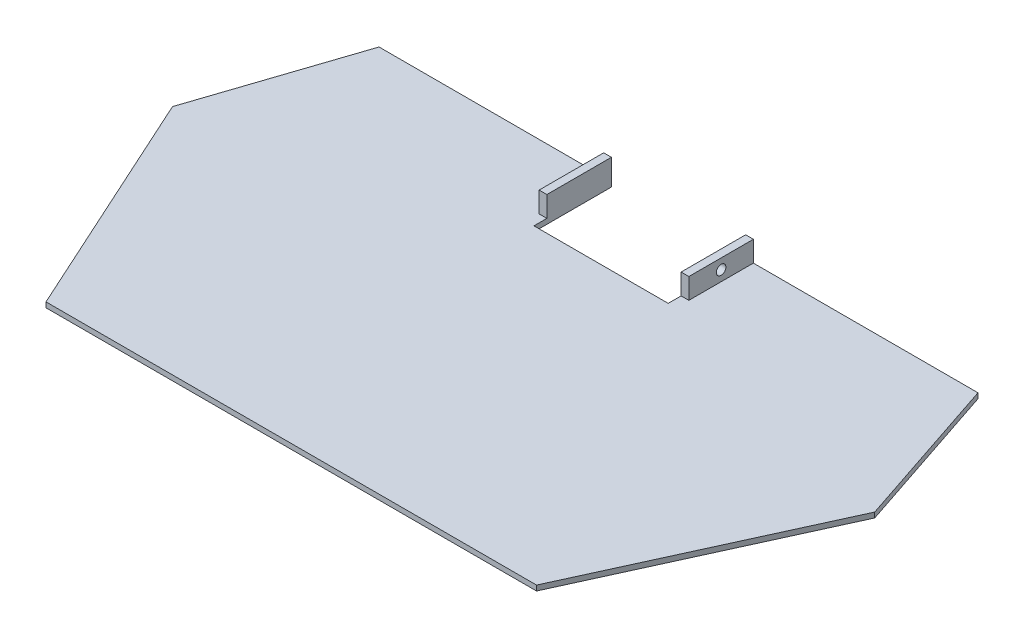
ISO-10303-21;
HEADER;
FILE_DESCRIPTION(('STEP AP214'),'2;1');
FILE_NAME('part.step','',(''),(''),'','','');
FILE_SCHEMA(('AUTOMOTIVE_DESIGN { 1 0 10303 214 1 1 1 1 }'));
ENDSEC;
DATA;
#1=APPLICATION_CONTEXT('core data for automotive mechanical design processes');
#2=APPLICATION_PROTOCOL_DEFINITION('international standard','automotive_design',2000,#1);
#3=PRODUCT_CONTEXT('',#1,'mechanical');
#4=PRODUCT('Part','Part','',(#3));
#5=PRODUCT_RELATED_PRODUCT_CATEGORY('part','',(#4));
#6=PRODUCT_DEFINITION_FORMATION('','',#4);
#7=PRODUCT_DEFINITION_CONTEXT('part definition',#1,'design');
#8=PRODUCT_DEFINITION('design','',#6,#7);
#9=PRODUCT_DEFINITION_SHAPE('','',#8);
#10=(LENGTH_UNIT() NAMED_UNIT(*) SI_UNIT(.MILLI.,.METRE.));
#11=(NAMED_UNIT(*) PLANE_ANGLE_UNIT() SI_UNIT($,.RADIAN.));
#12=(NAMED_UNIT(*) SI_UNIT($,.STERADIAN.) SOLID_ANGLE_UNIT());
#13=UNCERTAINTY_MEASURE_WITH_UNIT(LENGTH_MEASURE(1.E-05),#10,'distance_accuracy_value','');
#14=(GEOMETRIC_REPRESENTATION_CONTEXT(3) GLOBAL_UNCERTAINTY_ASSIGNED_CONTEXT((#13)) GLOBAL_UNIT_ASSIGNED_CONTEXT((#10,
#11,#12)) REPRESENTATION_CONTEXT('',''));
#15=CARTESIAN_POINT('',(0.,0.,0.));
#16=DIRECTION('',(0.,0.,1.));
#17=DIRECTION('',(1.,0.,0.));
#18=AXIS2_PLACEMENT_3D('',#15,#16,#17);
#19=CARTESIAN_POINT('',(0.,2.,0.));
#20=DIRECTION('',(0.,1.,0.));
#21=DIRECTION('',(0.,0.,1.));
#22=AXIS2_PLACEMENT_3D('',#19,#20,#21);
#23=PLANE('',#22);
#24=DIRECTION('',(0.,0.,-1.));
#25=VECTOR('',#24,1.);
#26=CARTESIAN_POINT('',(29.,2.,-60.));
#27=LINE('',#26,#25);
#28=CARTESIAN_POINT('',(29.,2.,-35.));
#29=VERTEX_POINT('',#28);
#30=CARTESIAN_POINT('',(29.,2.,-60.));
#31=VERTEX_POINT('',#30);
#32=EDGE_CURVE('E153',#29,#31,#27,.T.);
#33=ORIENTED_EDGE('',*,*,#32,.F.);
#34=DIRECTION('',(1.,0.,0.));
#35=VECTOR('',#34,1.);
#36=CARTESIAN_POINT('',(26.,2.,-35.));
#37=LINE('',#36,#35);
#38=CARTESIAN_POINT('',(26.,2.,-35.));
#39=VERTEX_POINT('',#38);
#40=EDGE_CURVE('E160',#39,#29,#37,.T.);
#41=ORIENTED_EDGE('',*,*,#40,.F.);
#42=DIRECTION('',(0.,0.,1.));
#43=VECTOR('',#42,1.);
#44=CARTESIAN_POINT('',(26.,2.,-30.));
#45=LINE('',#44,#43);
#46=CARTESIAN_POINT('',(26.,2.,-30.));
#47=VERTEX_POINT('',#46);
#48=EDGE_CURVE('E173',#39,#47,#45,.T.);
#49=ORIENTED_EDGE('',*,*,#48,.T.);
#50=DIRECTION('',(-1.,0.,0.));
#51=VECTOR('',#50,1.);
#52=CARTESIAN_POINT('',(26.,2.,-30.));
#53=LINE('',#52,#51);
#54=CARTESIAN_POINT('',(-26.,2.,-30.));
#55=VERTEX_POINT('',#54);
#56=EDGE_CURVE('E175',#47,#55,#53,.T.);
#57=ORIENTED_EDGE('',*,*,#56,.T.);
#58=DIRECTION('',(0.,0.,-1.));
#59=VECTOR('',#58,1.);
#60=CARTESIAN_POINT('',(-26.,2.,-30.));
#61=LINE('',#60,#59);
#62=CARTESIAN_POINT('',(-26.,2.,-35.));
#63=VERTEX_POINT('',#62);
#64=EDGE_CURVE('E182',#55,#63,#61,.T.);
#65=ORIENTED_EDGE('',*,*,#64,.T.);
#66=DIRECTION('',(1.,0.,0.));
#67=VECTOR('',#66,1.);
#68=CARTESIAN_POINT('',(-26.,2.,-35.));
#69=LINE('',#68,#67);
#70=CARTESIAN_POINT('',(-29.,2.,-35.));
#71=VERTEX_POINT('',#70);
#72=EDGE_CURVE('E265',#71,#63,#69,.T.);
#73=ORIENTED_EDGE('',*,*,#72,.F.);
#74=DIRECTION('',(0.,0.,1.));
#75=VECTOR('',#74,1.);
#76=CARTESIAN_POINT('',(-29.,2.,-60.));
#77=LINE('',#76,#75);
#78=CARTESIAN_POINT('',(-29.,2.,-60.));
#79=VERTEX_POINT('',#78);
#80=EDGE_CURVE('E63',#79,#71,#77,.T.);
#81=ORIENTED_EDGE('',*,*,#80,.F.);
#82=DIRECTION('',(-1.,0.,0.));
#83=VECTOR('',#82,1.);
#84=CARTESIAN_POINT('',(-26.,2.,-60.));
#85=LINE('',#84,#83);
#86=CARTESIAN_POINT('',(-116.,2.,-60.));
#87=VERTEX_POINT('',#86);
#88=EDGE_CURVE('E184',#79,#87,#85,.T.);
#89=ORIENTED_EDGE('',*,*,#88,.T.);
#90=DIRECTION('',(-0.316227766016837,0.,0.948683298050514));
#91=VECTOR('',#90,1.);
#92=CARTESIAN_POINT('',(-116.,2.,-60.));
#93=LINE('',#92,#91);
#94=CARTESIAN_POINT('',(-136.,2.,0.));
#95=VERTEX_POINT('',#94);
#96=EDGE_CURVE('E186',#87,#95,#93,.T.);
#97=ORIENTED_EDGE('',*,*,#96,.T.);
#98=DIRECTION('',(0.414564612099925,0.,0.910019880219349));
#99=VECTOR('',#98,1.);
#100=CARTESIAN_POINT('',(-136.,2.,0.));
#101=LINE('',#100,#99);
#102=CARTESIAN_POINT('',(-95.,2.,90.));
#103=VERTEX_POINT('',#102);
#104=EDGE_CURVE('E188',#95,#103,#101,.T.);
#105=ORIENTED_EDGE('',*,*,#104,.T.);
#106=DIRECTION('',(1.,0.,0.));
#107=VECTOR('',#106,1.);
#108=CARTESIAN_POINT('',(-95.,2.,90.));
#109=LINE('',#108,#107);
#110=CARTESIAN_POINT('',(95.,2.,90.));
#111=VERTEX_POINT('',#110);
#112=EDGE_CURVE('E190',#103,#111,#109,.T.);
#113=ORIENTED_EDGE('',*,*,#112,.T.);
#114=DIRECTION('',(0.414564612099925,0.,-0.910019880219349));
#115=VECTOR('',#114,1.);
#116=CARTESIAN_POINT('',(136.,2.,0.));
#117=LINE('',#116,#115);
#118=CARTESIAN_POINT('',(136.,2.,0.));
#119=VERTEX_POINT('',#118);
#120=EDGE_CURVE('E192',#111,#119,#117,.T.);
#121=ORIENTED_EDGE('',*,*,#120,.T.);
#122=DIRECTION('',(-0.316227766016837,0.,-0.948683298050514));
#123=VECTOR('',#122,1.);
#124=CARTESIAN_POINT('',(116.,2.,-60.));
#125=LINE('',#124,#123);
#126=CARTESIAN_POINT('',(116.,2.,-60.));
#127=VERTEX_POINT('',#126);
#128=EDGE_CURVE('E171',#119,#127,#125,.T.);
#129=ORIENTED_EDGE('',*,*,#128,.T.);
#130=DIRECTION('',(-1.,0.,0.));
#131=VECTOR('',#130,1.);
#132=CARTESIAN_POINT('',(26.,2.,-60.));
#133=LINE('',#132,#131);
#134=EDGE_CURVE('E165',#127,#31,#133,.T.);
#135=ORIENTED_EDGE('',*,*,#134,.T.);
#136=EDGE_LOOP('',(#33,#41,#49,#57,#65,#73,#81,#89,#97,#105,#113,#121,#129,#135));
#137=FACE_BOUND('',#136,.T.);
#138=ADVANCED_FACE('F39',(#137),#23,.T.);
#139=CARTESIAN_POINT('',(116.,2.,-60.));
#140=DIRECTION('',(-0.948683298050514,0.,0.316227766016837));
#141=DIRECTION('',(0.316227766016837,0.,0.948683298050514));
#142=AXIS2_PLACEMENT_3D('',#139,#140,#141);
#143=PLANE('',#142);
#144=DIRECTION('',(-0.316227766016837,0.,-0.948683298050514));
#145=VECTOR('',#144,1.);
#146=CARTESIAN_POINT('',(116.,0.,-60.));
#147=LINE('',#146,#145);
#148=CARTESIAN_POINT('',(136.,0.,0.));
#149=VERTEX_POINT('',#148);
#150=CARTESIAN_POINT('',(116.,0.,-60.));
#151=VERTEX_POINT('',#150);
#152=EDGE_CURVE('E195',#149,#151,#147,.T.);
#153=ORIENTED_EDGE('',*,*,#152,.T.);
#154=DIRECTION('',(0.,-1.,0.));
#155=VECTOR('',#154,1.);
#156=CARTESIAN_POINT('',(116.,2.,-60.));
#157=LINE('',#156,#155);
#158=EDGE_CURVE('E11',#127,#151,#157,.T.);
#159=ORIENTED_EDGE('',*,*,#158,.F.);
#160=ORIENTED_EDGE('',*,*,#128,.F.);
#161=DIRECTION('',(0.,-1.,0.));
#162=VECTOR('',#161,1.);
#163=CARTESIAN_POINT('',(136.,2.,0.));
#164=LINE('',#163,#162);
#165=EDGE_CURVE('E194',#119,#149,#164,.T.);
#166=ORIENTED_EDGE('',*,*,#165,.T.);
#167=EDGE_LOOP('',(#153,#159,#160,#166));
#168=FACE_BOUND('',#167,.T.);
#169=ADVANCED_FACE('F41',(#168),#143,.F.);
#170=CARTESIAN_POINT('',(26.,2.,-60.));
#171=DIRECTION('',(0.,0.,1.));
#172=DIRECTION('',(1.,0.,0.));
#173=AXIS2_PLACEMENT_3D('',#170,#171,#172);
#174=PLANE('',#173);
#175=DIRECTION('',(-1.,0.,0.));
#176=VECTOR('',#175,1.);
#177=CARTESIAN_POINT('',(26.,0.,-60.));
#178=LINE('',#177,#176);
#179=CARTESIAN_POINT('',(26.,0.,-60.));
#180=VERTEX_POINT('',#179);
#181=EDGE_CURVE('E198',#151,#180,#178,.T.);
#182=ORIENTED_EDGE('',*,*,#181,.T.);
#183=DIRECTION('',(0.,-1.,0.));
#184=VECTOR('',#183,1.);
#185=CARTESIAN_POINT('',(26.,2.,-60.));
#186=LINE('',#185,#184);
#187=CARTESIAN_POINT('',(26.,10.,-60.));
#188=VERTEX_POINT('',#187);
#189=EDGE_CURVE('E48',#188,#180,#186,.T.);
#190=ORIENTED_EDGE('',*,*,#189,.F.);
#191=DIRECTION('',(-1.,0.,0.));
#192=VECTOR('',#191,1.);
#193=CARTESIAN_POINT('',(26.,10.,-60.));
#194=LINE('',#193,#192);
#195=CARTESIAN_POINT('',(29.,10.,-60.));
#196=VERTEX_POINT('',#195);
#197=EDGE_CURVE('E161',#196,#188,#194,.T.);
#198=ORIENTED_EDGE('',*,*,#197,.F.);
#199=DIRECTION('',(0.,-1.,0.));
#200=VECTOR('',#199,1.);
#201=CARTESIAN_POINT('',(29.,10.,-60.));
#202=LINE('',#201,#200);
#203=EDGE_CURVE('E156',#196,#31,#202,.T.);
#204=ORIENTED_EDGE('',*,*,#203,.T.);
#205=ORIENTED_EDGE('',*,*,#134,.F.);
#206=ORIENTED_EDGE('',*,*,#158,.T.);
#207=EDGE_LOOP('',(#182,#190,#198,#204,#205,#206));
#208=FACE_BOUND('',#207,.T.);
#209=ADVANCED_FACE('F164',(#208),#174,.F.);
#210=CARTESIAN_POINT('',(26.,2.,-30.));
#211=DIRECTION('',(1.,0.,0.));
#212=DIRECTION('',(0.,0.,-1.));
#213=AXIS2_PLACEMENT_3D('',#210,#211,#212);
#214=PLANE('',#213);
#215=CARTESIAN_POINT('',(26.,6.,-47.5));
#216=DIRECTION('',(-1.,0.,0.));
#217=DIRECTION('',(0.,0.,1.));
#218=AXIS2_PLACEMENT_3D('',#215,#216,#217);
#219=CIRCLE('',#218,1.85);
#220=CARTESIAN_POINT('',(26.,6.,-45.65));
#221=VERTEX_POINT('',#220);
#222=EDGE_CURVE('E327',#221,#221,#219,.T.);
#223=ORIENTED_EDGE('',*,*,#222,.F.);
#224=EDGE_LOOP('',(#223));
#225=FACE_BOUND('',#224,.T.);
#226=DIRECTION('',(0.,0.,1.));
#227=VECTOR('',#226,1.);
#228=CARTESIAN_POINT('',(26.,0.,-30.));
#229=LINE('',#228,#227);
#230=CARTESIAN_POINT('',(26.,0.,-30.));
#231=VERTEX_POINT('',#230);
#232=EDGE_CURVE('E201',#180,#231,#229,.T.);
#233=ORIENTED_EDGE('',*,*,#232,.T.);
#234=DIRECTION('',(0.,-1.,0.));
#235=VECTOR('',#234,1.);
#236=CARTESIAN_POINT('',(26.,2.,-30.));
#237=LINE('',#236,#235);
#238=EDGE_CURVE('E236',#47,#231,#237,.T.);
#239=ORIENTED_EDGE('',*,*,#238,.F.);
#240=ORIENTED_EDGE('',*,*,#48,.F.);
#241=DIRECTION('',(0.,-1.,0.));
#242=VECTOR('',#241,1.);
#243=CARTESIAN_POINT('',(26.,10.,-35.));
#244=LINE('',#243,#242);
#245=CARTESIAN_POINT('',(26.,10.,-35.));
#246=VERTEX_POINT('',#245);
#247=EDGE_CURVE('E325',#246,#39,#244,.T.);
#248=ORIENTED_EDGE('',*,*,#247,.F.);
#249=DIRECTION('',(0.,0.,1.));
#250=VECTOR('',#249,1.);
#251=CARTESIAN_POINT('',(26.,10.,-60.));
#252=LINE('',#251,#250);
#253=EDGE_CURVE('E246',#188,#246,#252,.T.);
#254=ORIENTED_EDGE('',*,*,#253,.F.);
#255=ORIENTED_EDGE('',*,*,#189,.T.);
#256=EDGE_LOOP('',(#233,#239,#240,#248,#254,#255));
#257=FACE_BOUND('',#256,.T.);
#258=ADVANCED_FACE('F243',(#225,#257),#214,.F.);
#259=CARTESIAN_POINT('',(26.,2.,-30.));
#260=DIRECTION('',(0.,0.,1.));
#261=DIRECTION('',(1.,0.,0.));
#262=AXIS2_PLACEMENT_3D('',#259,#260,#261);
#263=PLANE('',#262);
#264=DIRECTION('',(-1.,0.,0.));
#265=VECTOR('',#264,1.);
#266=CARTESIAN_POINT('',(26.,0.,-30.));
#267=LINE('',#266,#265);
#268=CARTESIAN_POINT('',(-26.,0.,-30.));
#269=VERTEX_POINT('',#268);
#270=EDGE_CURVE('E203',#231,#269,#267,.T.);
#271=ORIENTED_EDGE('',*,*,#270,.T.);
#272=DIRECTION('',(0.,-1.,0.));
#273=VECTOR('',#272,1.);
#274=CARTESIAN_POINT('',(-26.,2.,-30.));
#275=LINE('',#274,#273);
#276=EDGE_CURVE('E233',#55,#269,#275,.T.);
#277=ORIENTED_EDGE('',*,*,#276,.F.);
#278=ORIENTED_EDGE('',*,*,#56,.F.);
#279=ORIENTED_EDGE('',*,*,#238,.T.);
#280=EDGE_LOOP('',(#271,#277,#278,#279));
#281=FACE_BOUND('',#280,.T.);
#282=ADVANCED_FACE('F255',(#281),#263,.F.);
#283=CARTESIAN_POINT('',(-26.,2.,-30.));
#284=DIRECTION('',(-1.,0.,0.));
#285=DIRECTION('',(0.,0.,1.));
#286=AXIS2_PLACEMENT_3D('',#283,#284,#285);
#287=PLANE('',#286);
#288=DIRECTION('',(0.,0.,-1.));
#289=VECTOR('',#288,1.);
#290=CARTESIAN_POINT('',(-26.,0.,-30.));
#291=LINE('',#290,#289);
#292=CARTESIAN_POINT('',(-26.,0.,-60.));
#293=VERTEX_POINT('',#292);
#294=EDGE_CURVE('E205',#269,#293,#291,.T.);
#295=ORIENTED_EDGE('',*,*,#294,.T.);
#296=DIRECTION('',(0.,-1.,0.));
#297=VECTOR('',#296,1.);
#298=CARTESIAN_POINT('',(-26.,2.,-60.));
#299=LINE('',#298,#297);
#300=CARTESIAN_POINT('',(-26.,10.,-60.));
#301=VERTEX_POINT('',#300);
#302=EDGE_CURVE('E230',#301,#293,#299,.T.);
#303=ORIENTED_EDGE('',*,*,#302,.F.);
#304=DIRECTION('',(0.,0.,-1.));
#305=VECTOR('',#304,1.);
#306=CARTESIAN_POINT('',(-26.,10.,-60.));
#307=LINE('',#306,#305);
#308=CARTESIAN_POINT('',(-26.,10.,-35.));
#309=VERTEX_POINT('',#308);
#310=EDGE_CURVE('E272',#309,#301,#307,.T.);
#311=ORIENTED_EDGE('',*,*,#310,.F.);
#312=DIRECTION('',(0.,-1.,0.));
#313=VECTOR('',#312,1.);
#314=CARTESIAN_POINT('',(-26.,10.,-35.));
#315=LINE('',#314,#313);
#316=EDGE_CURVE('E263',#309,#63,#315,.T.);
#317=ORIENTED_EDGE('',*,*,#316,.T.);
#318=ORIENTED_EDGE('',*,*,#64,.F.);
#319=ORIENTED_EDGE('',*,*,#276,.T.);
#320=EDGE_LOOP('',(#295,#303,#311,#317,#318,#319));
#321=FACE_BOUND('',#320,.T.);
#322=ADVANCED_FACE('F259',(#321),#287,.F.);
#323=CARTESIAN_POINT('',(-26.,2.,-60.));
#324=DIRECTION('',(0.,0.,1.));
#325=DIRECTION('',(1.,0.,0.));
#326=AXIS2_PLACEMENT_3D('',#323,#324,#325);
#327=PLANE('',#326);
#328=DIRECTION('',(-1.,0.,0.));
#329=VECTOR('',#328,1.);
#330=CARTESIAN_POINT('',(-26.,0.,-60.));
#331=LINE('',#330,#329);
#332=CARTESIAN_POINT('',(-116.,0.,-60.));
#333=VERTEX_POINT('',#332);
#334=EDGE_CURVE('E207',#293,#333,#331,.T.);
#335=ORIENTED_EDGE('',*,*,#334,.T.);
#336=DIRECTION('',(0.,-1.,0.));
#337=VECTOR('',#336,1.);
#338=CARTESIAN_POINT('',(-116.,2.,-60.));
#339=LINE('',#338,#337);
#340=EDGE_CURVE('E227',#87,#333,#339,.T.);
#341=ORIENTED_EDGE('',*,*,#340,.F.);
#342=ORIENTED_EDGE('',*,*,#88,.F.);
#343=DIRECTION('',(0.,-1.,0.));
#344=VECTOR('',#343,1.);
#345=CARTESIAN_POINT('',(-29.,10.,-60.));
#346=LINE('',#345,#344);
#347=CARTESIAN_POINT('',(-29.,10.,-60.));
#348=VERTEX_POINT('',#347);
#349=EDGE_CURVE('E199',#348,#79,#346,.T.);
#350=ORIENTED_EDGE('',*,*,#349,.F.);
#351=DIRECTION('',(-1.,0.,0.));
#352=VECTOR('',#351,1.);
#353=CARTESIAN_POINT('',(-26.,10.,-60.));
#354=LINE('',#353,#352);
#355=EDGE_CURVE('E275',#301,#348,#354,.T.);
#356=ORIENTED_EDGE('',*,*,#355,.F.);
#357=ORIENTED_EDGE('',*,*,#302,.T.);
#358=EDGE_LOOP('',(#335,#341,#342,#350,#356,#357));
#359=FACE_BOUND('',#358,.T.);
#360=ADVANCED_FACE('F290',(#359),#327,.F.);
#361=CARTESIAN_POINT('',(-116.,2.,-60.));
#362=DIRECTION('',(0.948683298050514,0.,0.316227766016837));
#363=DIRECTION('',(0.316227766016837,0.,-0.948683298050514));
#364=AXIS2_PLACEMENT_3D('',#361,#362,#363);
#365=PLANE('',#364);
#366=DIRECTION('',(-0.316227766016837,0.,0.948683298050514));
#367=VECTOR('',#366,1.);
#368=CARTESIAN_POINT('',(-116.,0.,-60.));
#369=LINE('',#368,#367);
#370=CARTESIAN_POINT('',(-136.,0.,0.));
#371=VERTEX_POINT('',#370);
#372=EDGE_CURVE('E209',#333,#371,#369,.T.);
#373=ORIENTED_EDGE('',*,*,#372,.T.);
#374=DIRECTION('',(0.,-1.,0.));
#375=VECTOR('',#374,1.);
#376=CARTESIAN_POINT('',(-136.,2.,0.));
#377=LINE('',#376,#375);
#378=EDGE_CURVE('E224',#95,#371,#377,.T.);
#379=ORIENTED_EDGE('',*,*,#378,.F.);
#380=ORIENTED_EDGE('',*,*,#96,.F.);
#381=ORIENTED_EDGE('',*,*,#340,.T.);
#382=EDGE_LOOP('',(#373,#379,#380,#381));
#383=FACE_BOUND('',#382,.T.);
#384=ADVANCED_FACE('F297',(#383),#365,.F.);
#385=CARTESIAN_POINT('',(-136.,2.,0.));
#386=DIRECTION('',(0.910019880219349,0.,-0.414564612099925));
#387=DIRECTION('',(-0.414564612099925,0.,-0.910019880219349));
#388=AXIS2_PLACEMENT_3D('',#385,#386,#387);
#389=PLANE('',#388);
#390=DIRECTION('',(0.414564612099925,0.,0.910019880219349));
#391=VECTOR('',#390,1.);
#392=CARTESIAN_POINT('',(-136.,0.,0.));
#393=LINE('',#392,#391);
#394=CARTESIAN_POINT('',(-95.,0.,90.));
#395=VERTEX_POINT('',#394);
#396=EDGE_CURVE('E211',#371,#395,#393,.T.);
#397=ORIENTED_EDGE('',*,*,#396,.T.);
#398=DIRECTION('',(0.,-1.,0.));
#399=VECTOR('',#398,1.);
#400=CARTESIAN_POINT('',(-95.,2.,90.));
#401=LINE('',#400,#399);
#402=EDGE_CURVE('E221',#103,#395,#401,.T.);
#403=ORIENTED_EDGE('',*,*,#402,.F.);
#404=ORIENTED_EDGE('',*,*,#104,.F.);
#405=ORIENTED_EDGE('',*,*,#378,.T.);
#406=EDGE_LOOP('',(#397,#403,#404,#405));
#407=FACE_BOUND('',#406,.T.);
#408=ADVANCED_FACE('F301',(#407),#389,.F.);
#409=CARTESIAN_POINT('',(-95.,2.,90.));
#410=DIRECTION('',(0.,0.,-1.));
#411=DIRECTION('',(-1.,0.,0.));
#412=AXIS2_PLACEMENT_3D('',#409,#410,#411);
#413=PLANE('',#412);
#414=DIRECTION('',(1.,0.,0.));
#415=VECTOR('',#414,1.);
#416=CARTESIAN_POINT('',(-95.,0.,90.));
#417=LINE('',#416,#415);
#418=CARTESIAN_POINT('',(95.,0.,90.));
#419=VERTEX_POINT('',#418);
#420=EDGE_CURVE('E213',#395,#419,#417,.T.);
#421=ORIENTED_EDGE('',*,*,#420,.T.);
#422=DIRECTION('',(0.,-1.,0.));
#423=VECTOR('',#422,1.);
#424=CARTESIAN_POINT('',(95.,2.,90.));
#425=LINE('',#424,#423);
#426=EDGE_CURVE('E218',#111,#419,#425,.T.);
#427=ORIENTED_EDGE('',*,*,#426,.F.);
#428=ORIENTED_EDGE('',*,*,#112,.F.);
#429=ORIENTED_EDGE('',*,*,#402,.T.);
#430=EDGE_LOOP('',(#421,#427,#428,#429));
#431=FACE_BOUND('',#430,.T.);
#432=ADVANCED_FACE('F306',(#431),#413,.F.);
#433=CARTESIAN_POINT('',(136.,2.,0.));
#434=DIRECTION('',(-0.910019880219349,0.,-0.414564612099925));
#435=DIRECTION('',(-0.414564612099925,0.,0.910019880219349));
#436=AXIS2_PLACEMENT_3D('',#433,#434,#435);
#437=PLANE('',#436);
#438=DIRECTION('',(0.414564612099925,0.,-0.910019880219349));
#439=VECTOR('',#438,1.);
#440=CARTESIAN_POINT('',(136.,0.,0.));
#441=LINE('',#440,#439);
#442=EDGE_CURVE('E177',#419,#149,#441,.T.);
#443=ORIENTED_EDGE('',*,*,#442,.T.);
#444=ORIENTED_EDGE('',*,*,#165,.F.);
#445=ORIENTED_EDGE('',*,*,#120,.F.);
#446=ORIENTED_EDGE('',*,*,#426,.T.);
#447=EDGE_LOOP('',(#443,#444,#445,#446));
#448=FACE_BOUND('',#447,.T.);
#449=ADVANCED_FACE('F310',(#448),#437,.F.);
#450=CARTESIAN_POINT('',(0.,0.,0.));
#451=DIRECTION('',(0.,1.,0.));
#452=DIRECTION('',(0.,0.,1.));
#453=AXIS2_PLACEMENT_3D('',#450,#451,#452);
#454=PLANE('',#453);
#455=ORIENTED_EDGE('',*,*,#152,.F.);
#456=ORIENTED_EDGE('',*,*,#442,.F.);
#457=ORIENTED_EDGE('',*,*,#420,.F.);
#458=ORIENTED_EDGE('',*,*,#396,.F.);
#459=ORIENTED_EDGE('',*,*,#372,.F.);
#460=ORIENTED_EDGE('',*,*,#334,.F.);
#461=ORIENTED_EDGE('',*,*,#294,.F.);
#462=ORIENTED_EDGE('',*,*,#270,.F.);
#463=ORIENTED_EDGE('',*,*,#232,.F.);
#464=ORIENTED_EDGE('',*,*,#181,.F.);
#465=EDGE_LOOP('',(#455,#456,#457,#458,#459,#460,#461,#462,#463,#464));
#466=FACE_BOUND('',#465,.T.);
#467=ADVANCED_FACE('F250',(#466),#454,.F.);
#468=CARTESIAN_POINT('',(-29.,10.,-60.));
#469=DIRECTION('',(1.,0.,0.));
#470=DIRECTION('',(0.,0.,-1.));
#471=AXIS2_PLACEMENT_3D('',#468,#469,#470);
#472=PLANE('',#471);
#473=ORIENTED_EDGE('',*,*,#80,.T.);
#474=DIRECTION('',(0.,-1.,0.));
#475=VECTOR('',#474,1.);
#476=CARTESIAN_POINT('',(-29.,10.,-35.));
#477=LINE('',#476,#475);
#478=CARTESIAN_POINT('',(-29.,10.,-35.));
#479=VERTEX_POINT('',#478);
#480=EDGE_CURVE('E271',#479,#71,#477,.T.);
#481=ORIENTED_EDGE('',*,*,#480,.F.);
#482=DIRECTION('',(0.,0.,1.));
#483=VECTOR('',#482,1.);
#484=CARTESIAN_POINT('',(-29.,10.,-60.));
#485=LINE('',#484,#483);
#486=EDGE_CURVE('E287',#348,#479,#485,.T.);
#487=ORIENTED_EDGE('',*,*,#486,.F.);
#488=ORIENTED_EDGE('',*,*,#349,.T.);
#489=EDGE_LOOP('',(#473,#481,#487,#488));
#490=FACE_BOUND('',#489,.T.);
#491=ADVANCED_FACE('F286',(#490),#472,.F.);
#492=CARTESIAN_POINT('',(-26.,10.,-35.));
#493=DIRECTION('',(0.,0.,-1.));
#494=DIRECTION('',(-1.,0.,0.));
#495=AXIS2_PLACEMENT_3D('',#492,#493,#494);
#496=PLANE('',#495);
#497=ORIENTED_EDGE('',*,*,#72,.T.);
#498=ORIENTED_EDGE('',*,*,#316,.F.);
#499=DIRECTION('',(1.,0.,0.));
#500=VECTOR('',#499,1.);
#501=CARTESIAN_POINT('',(-26.,10.,-35.));
#502=LINE('',#501,#500);
#503=EDGE_CURVE('E281',#479,#309,#502,.T.);
#504=ORIENTED_EDGE('',*,*,#503,.F.);
#505=ORIENTED_EDGE('',*,*,#480,.T.);
#506=EDGE_LOOP('',(#497,#498,#504,#505));
#507=FACE_BOUND('',#506,.T.);
#508=ADVANCED_FACE('F268',(#507),#496,.F.);
#509=CARTESIAN_POINT('',(0.,10.,0.));
#510=DIRECTION('',(0.,-1.,0.));
#511=DIRECTION('',(0.,0.,-1.));
#512=AXIS2_PLACEMENT_3D('',#509,#510,#511);
#513=PLANE('',#512);
#514=ORIENTED_EDGE('',*,*,#310,.T.);
#515=ORIENTED_EDGE('',*,*,#355,.T.);
#516=ORIENTED_EDGE('',*,*,#486,.T.);
#517=ORIENTED_EDGE('',*,*,#503,.T.);
#518=EDGE_LOOP('',(#514,#515,#516,#517));
#519=FACE_BOUND('',#518,.T.);
#520=ADVANCED_FACE('F314',(#519),#513,.F.);
#521=CARTESIAN_POINT('',(26.,10.,-35.));
#522=DIRECTION('',(0.,0.,-1.));
#523=DIRECTION('',(-1.,0.,0.));
#524=AXIS2_PLACEMENT_3D('',#521,#522,#523);
#525=PLANE('',#524);
#526=ORIENTED_EDGE('',*,*,#40,.T.);
#527=DIRECTION('',(0.,-1.,0.));
#528=VECTOR('',#527,1.);
#529=CARTESIAN_POINT('',(29.,10.,-35.));
#530=LINE('',#529,#528);
#531=CARTESIAN_POINT('',(29.,10.,-35.));
#532=VERTEX_POINT('',#531);
#533=EDGE_CURVE('E55',#532,#29,#530,.T.);
#534=ORIENTED_EDGE('',*,*,#533,.F.);
#535=DIRECTION('',(1.,0.,0.));
#536=VECTOR('',#535,1.);
#537=CARTESIAN_POINT('',(26.,10.,-35.));
#538=LINE('',#537,#536);
#539=EDGE_CURVE('E320',#246,#532,#538,.T.);
#540=ORIENTED_EDGE('',*,*,#539,.F.);
#541=ORIENTED_EDGE('',*,*,#247,.T.);
#542=EDGE_LOOP('',(#526,#534,#540,#541));
#543=FACE_BOUND('',#542,.T.);
#544=ADVANCED_FACE('F430',(#543),#525,.F.);
#545=CARTESIAN_POINT('',(29.,10.,-60.));
#546=DIRECTION('',(-1.,0.,0.));
#547=DIRECTION('',(0.,0.,1.));
#548=AXIS2_PLACEMENT_3D('',#545,#546,#547);
#549=PLANE('',#548);
#550=CARTESIAN_POINT('',(29.,6.,-47.5));
#551=DIRECTION('',(-1.,0.,0.));
#552=DIRECTION('',(0.,0.,1.));
#553=AXIS2_PLACEMENT_3D('',#550,#551,#552);
#554=CIRCLE('',#553,1.85);
#555=CARTESIAN_POINT('',(29.,6.,-45.65));
#556=VERTEX_POINT('',#555);
#557=EDGE_CURVE('E43',#556,#556,#554,.T.);
#558=ORIENTED_EDGE('',*,*,#557,.T.);
#559=EDGE_LOOP('',(#558));
#560=FACE_BOUND('',#559,.T.);
#561=ORIENTED_EDGE('',*,*,#32,.T.);
#562=ORIENTED_EDGE('',*,*,#203,.F.);
#563=DIRECTION('',(0.,0.,-1.));
#564=VECTOR('',#563,1.);
#565=CARTESIAN_POINT('',(29.,10.,-60.));
#566=LINE('',#565,#564);
#567=EDGE_CURVE('E168',#532,#196,#566,.T.);
#568=ORIENTED_EDGE('',*,*,#567,.F.);
#569=ORIENTED_EDGE('',*,*,#533,.T.);
#570=EDGE_LOOP('',(#561,#562,#568,#569));
#571=FACE_BOUND('',#570,.T.);
#572=ADVANCED_FACE('F155',(#560,#571),#549,.F.);
#573=CARTESIAN_POINT('',(0.,10.,0.));
#574=DIRECTION('',(0.,-1.,0.));
#575=DIRECTION('',(0.,0.,-1.));
#576=AXIS2_PLACEMENT_3D('',#573,#574,#575);
#577=PLANE('',#576);
#578=ORIENTED_EDGE('',*,*,#197,.T.);
#579=ORIENTED_EDGE('',*,*,#253,.T.);
#580=ORIENTED_EDGE('',*,*,#539,.T.);
#581=ORIENTED_EDGE('',*,*,#567,.T.);
#582=EDGE_LOOP('',(#578,#579,#580,#581));
#583=FACE_BOUND('',#582,.T.);
#584=ADVANCED_FACE('F337',(#583),#577,.F.);
#585=CARTESIAN_POINT('',(34.,6.,-47.5));
#586=DIRECTION('',(-1.,0.,0.));
#587=DIRECTION('',(0.,0.,1.));
#588=AXIS2_PLACEMENT_3D('',#585,#586,#587);
#589=CYLINDRICAL_SURFACE('',#588,1.85);
#590=ORIENTED_EDGE('',*,*,#222,.T.);
#591=EDGE_LOOP('',(#590));
#592=FACE_BOUND('',#591,.T.);
#593=ORIENTED_EDGE('',*,*,#557,.F.);
#594=EDGE_LOOP('',(#593));
#595=FACE_BOUND('',#594,.T.);
#596=ADVANCED_FACE('F335',(#592,#595),#589,.F.);
#597=CLOSED_SHELL('',(#138,#169,#209,#258,#282,#322,#360,#384,#408,#432,#449,#467,#491,#508,
#520,#544,#572,#584,#596));
#598=MANIFOLD_SOLID_BREP('B2',#597);
#599=ADVANCED_BREP_SHAPE_REPRESENTATION('',(#18,#598),#14);
#600=SHAPE_DEFINITION_REPRESENTATION(#9,#599);
ENDSEC;
END-ISO-10303-21;
